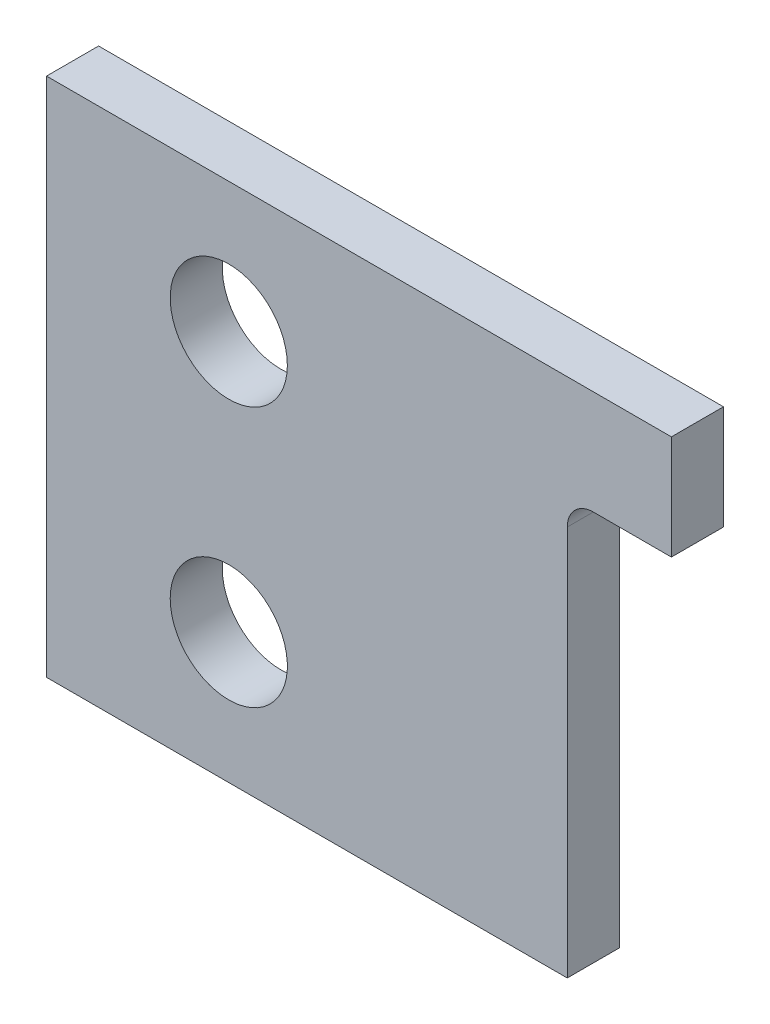
ISO-10303-21;
HEADER;
FILE_DESCRIPTION(('STEP AP214'),'2;1');
FILE_NAME('part.step','',(''),(''),'','','');
FILE_SCHEMA(('AUTOMOTIVE_DESIGN { 1 0 10303 214 1 1 1 1 }'));
ENDSEC;
DATA;
#1=APPLICATION_CONTEXT('core data for automotive mechanical design processes');
#2=APPLICATION_PROTOCOL_DEFINITION('international standard','automotive_design',2000,#1);
#3=PRODUCT_CONTEXT('',#1,'mechanical');
#4=PRODUCT('Part','Part','',(#3));
#5=PRODUCT_RELATED_PRODUCT_CATEGORY('part','',(#4));
#6=PRODUCT_DEFINITION_FORMATION('','',#4);
#7=PRODUCT_DEFINITION_CONTEXT('part definition',#1,'design');
#8=PRODUCT_DEFINITION('design','',#6,#7);
#9=PRODUCT_DEFINITION_SHAPE('','',#8);
#10=(LENGTH_UNIT() NAMED_UNIT(*) SI_UNIT(.MILLI.,.METRE.));
#11=(NAMED_UNIT(*) PLANE_ANGLE_UNIT() SI_UNIT($,.RADIAN.));
#12=(NAMED_UNIT(*) SI_UNIT($,.STERADIAN.) SOLID_ANGLE_UNIT());
#13=UNCERTAINTY_MEASURE_WITH_UNIT(LENGTH_MEASURE(1.E-05),#10,'distance_accuracy_value','');
#14=(GEOMETRIC_REPRESENTATION_CONTEXT(3) GLOBAL_UNCERTAINTY_ASSIGNED_CONTEXT((#13)) GLOBAL_UNIT_ASSIGNED_CONTEXT((#10,
#11,#12)) REPRESENTATION_CONTEXT('',''));
#15=CARTESIAN_POINT('',(0.,0.,0.));
#16=DIRECTION('',(0.,0.,1.));
#17=DIRECTION('',(1.,0.,0.));
#18=AXIS2_PLACEMENT_3D('',#15,#16,#17);
#19=CARTESIAN_POINT('',(0.,0.,2.));
#20=DIRECTION('',(0.,1.,0.));
#21=DIRECTION('',(0.,0.,1.));
#22=AXIS2_PLACEMENT_3D('',#19,#20,#21);
#23=PLANE('',#22);
#24=DIRECTION('',(1.,0.,0.));
#25=VECTOR('',#24,1.);
#26=CARTESIAN_POINT('',(0.,0.,0.));
#27=LINE('',#26,#25);
#28=CARTESIAN_POINT('',(0.,0.,0.));
#29=VERTEX_POINT('',#28);
#30=CARTESIAN_POINT('',(20.,0.,0.));
#31=VERTEX_POINT('',#30);
#32=EDGE_CURVE('E121',#29,#31,#27,.T.);
#33=ORIENTED_EDGE('',*,*,#32,.T.);
#34=DIRECTION('',(0.,0.,1.));
#35=VECTOR('',#34,1.);
#36=CARTESIAN_POINT('',(20.,0.,0.));
#37=LINE('',#36,#35);
#38=CARTESIAN_POINT('',(20.,0.,2.));
#39=VERTEX_POINT('',#38);
#40=EDGE_CURVE('E122',#31,#39,#37,.T.);
#41=ORIENTED_EDGE('',*,*,#40,.T.);
#42=DIRECTION('',(1.,0.,0.));
#43=VECTOR('',#42,1.);
#44=CARTESIAN_POINT('',(0.,0.,2.));
#45=LINE('',#44,#43);
#46=CARTESIAN_POINT('',(0.,0.,2.));
#47=VERTEX_POINT('',#46);
#48=EDGE_CURVE('E109',#47,#39,#45,.T.);
#49=ORIENTED_EDGE('',*,*,#48,.F.);
#50=DIRECTION('',(0.,0.,-1.));
#51=VECTOR('',#50,1.);
#52=CARTESIAN_POINT('',(0.,0.,2.));
#53=LINE('',#52,#51);
#54=EDGE_CURVE('E111',#47,#29,#53,.T.);
#55=ORIENTED_EDGE('',*,*,#54,.T.);
#56=EDGE_LOOP('',(#33,#41,#49,#55));
#57=FACE_BOUND('',#56,.T.);
#58=ADVANCED_FACE('F33',(#57),#23,.F.);
#59=CARTESIAN_POINT('',(0.,0.,2.));
#60=DIRECTION('',(1.,0.,0.));
#61=DIRECTION('',(0.,0.,-1.));
#62=AXIS2_PLACEMENT_3D('',#59,#60,#61);
#63=PLANE('',#62);
#64=DIRECTION('',(0.,-1.,0.));
#65=VECTOR('',#64,1.);
#66=CARTESIAN_POINT('',(0.,0.,0.));
#67=LINE('',#66,#65);
#68=CARTESIAN_POINT('',(0.,20.,0.));
#69=VERTEX_POINT('',#68);
#70=EDGE_CURVE('E118',#69,#29,#67,.T.);
#71=ORIENTED_EDGE('',*,*,#70,.T.);
#72=ORIENTED_EDGE('',*,*,#54,.F.);
#73=DIRECTION('',(0.,-1.,0.));
#74=VECTOR('',#73,1.);
#75=CARTESIAN_POINT('',(0.,0.,2.));
#76=LINE('',#75,#74);
#77=CARTESIAN_POINT('',(0.,20.,2.));
#78=VERTEX_POINT('',#77);
#79=EDGE_CURVE('E114',#78,#47,#76,.T.);
#80=ORIENTED_EDGE('',*,*,#79,.F.);
#81=DIRECTION('',(0.,0.,-1.));
#82=VECTOR('',#81,1.);
#83=CARTESIAN_POINT('',(0.,20.,2.));
#84=LINE('',#83,#82);
#85=EDGE_CURVE('E107',#78,#69,#84,.T.);
#86=ORIENTED_EDGE('',*,*,#85,.T.);
#87=EDGE_LOOP('',(#71,#72,#80,#86));
#88=FACE_BOUND('',#87,.T.);
#89=ADVANCED_FACE('F155',(#88),#63,.F.);
#90=CARTESIAN_POINT('',(0.,20.,2.));
#91=DIRECTION('',(0.,-1.,0.));
#92=DIRECTION('',(0.,0.,-1.));
#93=AXIS2_PLACEMENT_3D('',#90,#91,#92);
#94=PLANE('',#93);
#95=DIRECTION('',(-1.,0.,0.));
#96=VECTOR('',#95,1.);
#97=CARTESIAN_POINT('',(0.,20.,2.));
#98=LINE('',#97,#96);
#99=CARTESIAN_POINT('',(24.,20.,2.));
#100=VERTEX_POINT('',#99);
#101=EDGE_CURVE('E100',#100,#78,#98,.T.);
#102=ORIENTED_EDGE('',*,*,#101,.F.);
#103=DIRECTION('',(0.,0.,1.));
#104=VECTOR('',#103,1.);
#105=CARTESIAN_POINT('',(24.,20.,-8.));
#106=LINE('',#105,#104);
#107=CARTESIAN_POINT('',(24.,20.,0.));
#108=VERTEX_POINT('',#107);
#109=EDGE_CURVE('E88',#108,#100,#106,.T.);
#110=ORIENTED_EDGE('',*,*,#109,.F.);
#111=DIRECTION('',(-1.,0.,0.));
#112=VECTOR('',#111,1.);
#113=CARTESIAN_POINT('',(0.,20.,0.));
#114=LINE('',#113,#112);
#115=EDGE_CURVE('E125',#108,#69,#114,.T.);
#116=ORIENTED_EDGE('',*,*,#115,.T.);
#117=ORIENTED_EDGE('',*,*,#85,.F.);
#118=EDGE_LOOP('',(#102,#110,#116,#117));
#119=FACE_BOUND('',#118,.T.);
#120=ADVANCED_FACE('F105',(#119),#94,.F.);
#121=CARTESIAN_POINT('',(0.,20.,2.));
#122=DIRECTION('',(0.,0.,-1.));
#123=DIRECTION('',(-1.,0.,0.));
#124=AXIS2_PLACEMENT_3D('',#121,#122,#123);
#125=PLANE('',#124);
#126=CARTESIAN_POINT('',(7.,5.,2.));
#127=DIRECTION('',(0.,0.,1.));
#128=DIRECTION('',(-1.,0.,0.));
#129=AXIS2_PLACEMENT_3D('',#126,#127,#128);
#130=CIRCLE('',#129,2.25);
#131=CARTESIAN_POINT('',(4.75,5.,2.));
#132=VERTEX_POINT('',#131);
#133=EDGE_CURVE('E163',#132,#132,#130,.T.);
#134=ORIENTED_EDGE('',*,*,#133,.F.);
#135=EDGE_LOOP('',(#134));
#136=FACE_BOUND('',#135,.T.);
#137=CARTESIAN_POINT('',(7.,15.,2.));
#138=DIRECTION('',(0.,0.,1.));
#139=DIRECTION('',(1.,0.,0.));
#140=AXIS2_PLACEMENT_3D('',#137,#138,#139);
#141=CIRCLE('',#140,2.25);
#142=CARTESIAN_POINT('',(9.25,15.,2.));
#143=VERTEX_POINT('',#142);
#144=EDGE_CURVE('E170',#143,#143,#141,.T.);
#145=ORIENTED_EDGE('',*,*,#144,.F.);
#146=EDGE_LOOP('',(#145));
#147=FACE_BOUND('',#146,.T.);
#148=DIRECTION('',(-1.,0.,0.));
#149=VECTOR('',#148,1.);
#150=CARTESIAN_POINT('',(20.,16.,2.));
#151=LINE('',#150,#149);
#152=CARTESIAN_POINT('',(24.,16.,2.));
#153=VERTEX_POINT('',#152);
#154=CARTESIAN_POINT('',(21.,16.,2.));
#155=VERTEX_POINT('',#154);
#156=EDGE_CURVE('E103',#153,#155,#151,.T.);
#157=ORIENTED_EDGE('',*,*,#156,.F.);
#158=DIRECTION('',(0.,-1.,0.));
#159=VECTOR('',#158,1.);
#160=CARTESIAN_POINT('',(24.,20.,2.));
#161=LINE('',#160,#159);
#162=EDGE_CURVE('E48',#100,#153,#161,.T.);
#163=ORIENTED_EDGE('',*,*,#162,.F.);
#164=ORIENTED_EDGE('',*,*,#101,.T.);
#165=ORIENTED_EDGE('',*,*,#79,.T.);
#166=ORIENTED_EDGE('',*,*,#48,.T.);
#167=DIRECTION('',(0.,-1.,0.));
#168=VECTOR('',#167,1.);
#169=CARTESIAN_POINT('',(20.,0.,2.));
#170=LINE('',#169,#168);
#171=CARTESIAN_POINT('',(20.,15.,2.));
#172=VERTEX_POINT('',#171);
#173=EDGE_CURVE('E138',#172,#39,#170,.T.);
#174=ORIENTED_EDGE('',*,*,#173,.F.);
#175=CARTESIAN_POINT('',(21.,15.,2.));
#176=DIRECTION('',(0.,0.,-1.));
#177=DIRECTION('',(-1.,0.,0.));
#178=AXIS2_PLACEMENT_3D('',#175,#176,#177);
#179=CIRCLE('',#178,1.);
#180=EDGE_CURVE('E135',#172,#155,#179,.T.);
#181=ORIENTED_EDGE('',*,*,#180,.T.);
#182=EDGE_LOOP('',(#157,#163,#164,#165,#166,#174,#181));
#183=FACE_BOUND('',#182,.T.);
#184=ADVANCED_FACE('F98',(#136,#147,#183),#125,.F.);
#185=CARTESIAN_POINT('',(0.,20.,0.));
#186=DIRECTION('',(0.,0.,-1.));
#187=DIRECTION('',(-1.,0.,0.));
#188=AXIS2_PLACEMENT_3D('',#185,#186,#187);
#189=PLANE('',#188);
#190=DIRECTION('',(0.,1.,0.));
#191=VECTOR('',#190,1.);
#192=CARTESIAN_POINT('',(24.,20.,0.));
#193=LINE('',#192,#191);
#194=CARTESIAN_POINT('',(24.,16.,0.));
#195=VERTEX_POINT('',#194);
#196=EDGE_CURVE('E91',#195,#108,#193,.T.);
#197=ORIENTED_EDGE('',*,*,#196,.F.);
#198=DIRECTION('',(-1.,0.,0.));
#199=VECTOR('',#198,1.);
#200=CARTESIAN_POINT('',(20.,16.,0.));
#201=LINE('',#200,#199);
#202=CARTESIAN_POINT('',(21.,16.,0.));
#203=VERTEX_POINT('',#202);
#204=EDGE_CURVE('E144',#195,#203,#201,.T.);
#205=ORIENTED_EDGE('',*,*,#204,.T.);
#206=CARTESIAN_POINT('',(21.,15.,0.));
#207=DIRECTION('',(0.,0.,-1.));
#208=DIRECTION('',(-1.,0.,0.));
#209=AXIS2_PLACEMENT_3D('',#206,#207,#208);
#210=CIRCLE('',#209,1.);
#211=CARTESIAN_POINT('',(20.,15.,0.));
#212=VERTEX_POINT('',#211);
#213=EDGE_CURVE('E41',#203,#212,#210,.F.);
#214=ORIENTED_EDGE('',*,*,#213,.T.);
#215=DIRECTION('',(0.,-1.,0.));
#216=VECTOR('',#215,1.);
#217=CARTESIAN_POINT('',(20.,0.,0.));
#218=LINE('',#217,#216);
#219=EDGE_CURVE('E145',#212,#31,#218,.T.);
#220=ORIENTED_EDGE('',*,*,#219,.T.);
#221=ORIENTED_EDGE('',*,*,#32,.F.);
#222=ORIENTED_EDGE('',*,*,#70,.F.);
#223=ORIENTED_EDGE('',*,*,#115,.F.);
#224=EDGE_LOOP('',(#197,#205,#214,#220,#221,#222,#223));
#225=FACE_BOUND('',#224,.T.);
#226=CARTESIAN_POINT('',(7.,5.,0.));
#227=DIRECTION('',(0.,0.,1.));
#228=DIRECTION('',(-1.,0.,0.));
#229=AXIS2_PLACEMENT_3D('',#226,#227,#228);
#230=CIRCLE('',#229,2.25);
#231=CARTESIAN_POINT('',(4.75,5.,0.));
#232=VERTEX_POINT('',#231);
#233=EDGE_CURVE('E166',#232,#232,#230,.T.);
#234=ORIENTED_EDGE('',*,*,#233,.T.);
#235=EDGE_LOOP('',(#234));
#236=FACE_BOUND('',#235,.T.);
#237=CARTESIAN_POINT('',(7.,15.,0.));
#238=DIRECTION('',(0.,0.,1.));
#239=DIRECTION('',(1.,0.,0.));
#240=AXIS2_PLACEMENT_3D('',#237,#238,#239);
#241=CIRCLE('',#240,2.25);
#242=CARTESIAN_POINT('',(9.25,15.,0.));
#243=VERTEX_POINT('',#242);
#244=EDGE_CURVE('E148',#243,#243,#241,.T.);
#245=ORIENTED_EDGE('',*,*,#244,.T.);
#246=EDGE_LOOP('',(#245));
#247=FACE_BOUND('',#246,.T.);
#248=ADVANCED_FACE('F161',(#225,#236,#247),#189,.T.);
#249=CARTESIAN_POINT('',(20.,0.,0.));
#250=DIRECTION('',(-1.,0.,0.));
#251=DIRECTION('',(0.,0.,1.));
#252=AXIS2_PLACEMENT_3D('',#249,#250,#251);
#253=PLANE('',#252);
#254=ORIENTED_EDGE('',*,*,#219,.F.);
#255=DIRECTION('',(0.,0.,1.));
#256=VECTOR('',#255,1.);
#257=CARTESIAN_POINT('',(20.,15.,2.));
#258=LINE('',#257,#256);
#259=EDGE_CURVE('E132',#212,#172,#258,.T.);
#260=ORIENTED_EDGE('',*,*,#259,.T.);
#261=ORIENTED_EDGE('',*,*,#173,.T.);
#262=ORIENTED_EDGE('',*,*,#40,.F.);
#263=EDGE_LOOP('',(#254,#260,#261,#262));
#264=FACE_BOUND('',#263,.T.);
#265=ADVANCED_FACE('F160',(#264),#253,.F.);
#266=CARTESIAN_POINT('',(20.,16.,0.));
#267=DIRECTION('',(0.,1.,0.));
#268=DIRECTION('',(0.,0.,1.));
#269=AXIS2_PLACEMENT_3D('',#266,#267,#268);
#270=PLANE('',#269);
#271=ORIENTED_EDGE('',*,*,#204,.F.);
#272=DIRECTION('',(0.,0.,1.));
#273=VECTOR('',#272,1.);
#274=CARTESIAN_POINT('',(24.,16.,0.));
#275=LINE('',#274,#273);
#276=EDGE_CURVE('E11',#195,#153,#275,.T.);
#277=ORIENTED_EDGE('',*,*,#276,.T.);
#278=ORIENTED_EDGE('',*,*,#156,.T.);
#279=DIRECTION('',(0.,0.,1.));
#280=VECTOR('',#279,1.);
#281=CARTESIAN_POINT('',(21.,16.,0.));
#282=LINE('',#281,#280);
#283=EDGE_CURVE('E129',#155,#203,#282,.F.);
#284=ORIENTED_EDGE('',*,*,#283,.T.);
#285=EDGE_LOOP('',(#271,#277,#278,#284));
#286=FACE_BOUND('',#285,.T.);
#287=ADVANCED_FACE('F143',(#286),#270,.F.);
#288=CARTESIAN_POINT('',(21.,15.,0.));
#289=DIRECTION('',(0.,0.,-1.));
#290=DIRECTION('',(-1.,0.,0.));
#291=AXIS2_PLACEMENT_3D('',#288,#289,#290);
#292=CYLINDRICAL_SURFACE('',#291,1.);
#293=ORIENTED_EDGE('',*,*,#213,.F.);
#294=ORIENTED_EDGE('',*,*,#283,.F.);
#295=ORIENTED_EDGE('',*,*,#180,.F.);
#296=ORIENTED_EDGE('',*,*,#259,.F.);
#297=EDGE_LOOP('',(#293,#294,#295,#296));
#298=FACE_BOUND('',#297,.T.);
#299=ADVANCED_FACE('F35',(#298),#292,.F.);
#300=CARTESIAN_POINT('',(7.,15.,0.));
#301=DIRECTION('',(0.,0.,1.));
#302=DIRECTION('',(1.,0.,0.));
#303=AXIS2_PLACEMENT_3D('',#300,#301,#302);
#304=CYLINDRICAL_SURFACE('',#303,2.25);
#305=ORIENTED_EDGE('',*,*,#244,.F.);
#306=EDGE_LOOP('',(#305));
#307=FACE_BOUND('',#306,.T.);
#308=ORIENTED_EDGE('',*,*,#144,.T.);
#309=EDGE_LOOP('',(#308));
#310=FACE_BOUND('',#309,.T.);
#311=ADVANCED_FACE('F177',(#307,#310),#304,.F.);
#312=CARTESIAN_POINT('',(7.,5.,0.));
#313=DIRECTION('',(0.,0.,1.));
#314=DIRECTION('',(1.,0.,0.));
#315=AXIS2_PLACEMENT_3D('',#312,#313,#314);
#316=CYLINDRICAL_SURFACE('',#315,2.25);
#317=ORIENTED_EDGE('',*,*,#233,.F.);
#318=EDGE_LOOP('',(#317));
#319=FACE_BOUND('',#318,.T.);
#320=ORIENTED_EDGE('',*,*,#133,.T.);
#321=EDGE_LOOP('',(#320));
#322=FACE_BOUND('',#321,.T.);
#323=ADVANCED_FACE('F207',(#319,#322),#316,.F.);
#324=CARTESIAN_POINT('',(24.,20.,-8.));
#325=DIRECTION('',(-1.,0.,0.));
#326=DIRECTION('',(0.,-1.,0.));
#327=AXIS2_PLACEMENT_3D('',#324,#325,#326);
#328=PLANE('',#327);
#329=ORIENTED_EDGE('',*,*,#196,.T.);
#330=ORIENTED_EDGE('',*,*,#109,.T.);
#331=ORIENTED_EDGE('',*,*,#162,.T.);
#332=ORIENTED_EDGE('',*,*,#276,.F.);
#333=EDGE_LOOP('',(#329,#330,#331,#332));
#334=FACE_BOUND('',#333,.T.);
#335=ADVANCED_FACE('F89',(#334),#328,.F.);
#336=CLOSED_SHELL('',(#58,#89,#120,#184,#248,#265,#287,#299,#311,#323,#335));
#337=MANIFOLD_SOLID_BREP('B2',#336);
#338=ADVANCED_BREP_SHAPE_REPRESENTATION('',(#18,#337),#14);
#339=SHAPE_DEFINITION_REPRESENTATION(#9,#338);
ENDSEC;
END-ISO-10303-21;
